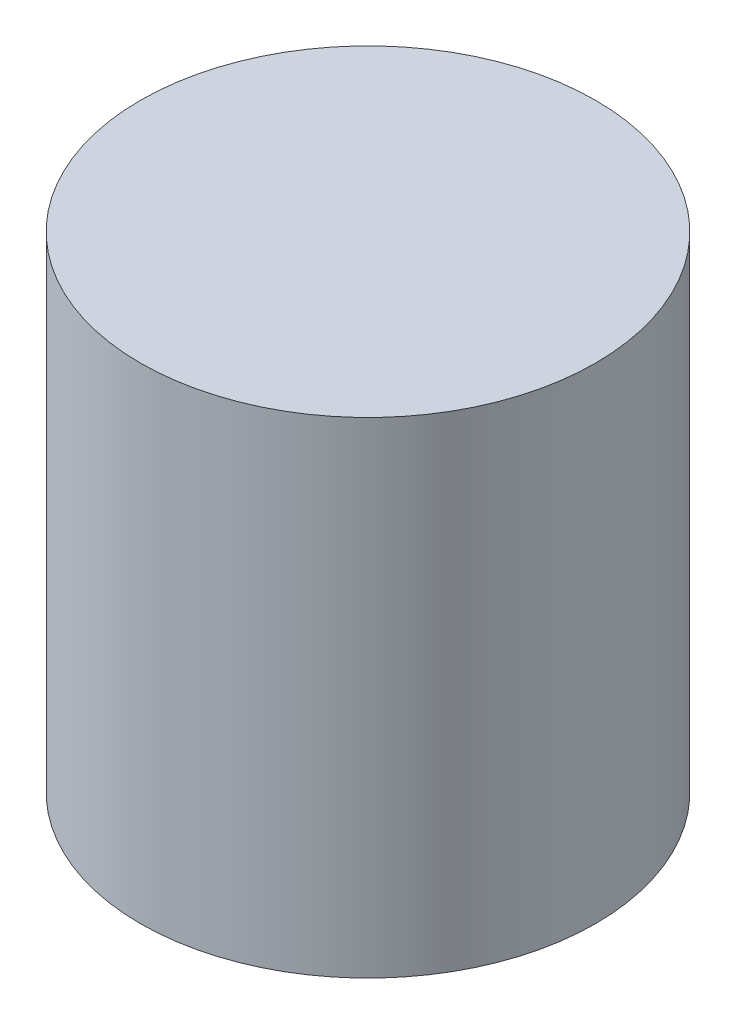
ISO-10303-21;
HEADER;
FILE_DESCRIPTION(('STEP AP214'),'2;1');
FILE_NAME('part.step','',(''),(''),'','','');
FILE_SCHEMA(('AUTOMOTIVE_DESIGN { 1 0 10303 214 1 1 1 1 }'));
ENDSEC;
DATA;
#1=APPLICATION_CONTEXT('core data for automotive mechanical design processes');
#2=APPLICATION_PROTOCOL_DEFINITION('international standard','automotive_design',2000,#1);
#3=PRODUCT_CONTEXT('',#1,'mechanical');
#4=PRODUCT('Part','Part','',(#3));
#5=PRODUCT_RELATED_PRODUCT_CATEGORY('part','',(#4));
#6=PRODUCT_DEFINITION_FORMATION('','',#4);
#7=PRODUCT_DEFINITION_CONTEXT('part definition',#1,'design');
#8=PRODUCT_DEFINITION('design','',#6,#7);
#9=PRODUCT_DEFINITION_SHAPE('','',#8);
#10=(LENGTH_UNIT() NAMED_UNIT(*) SI_UNIT(.MILLI.,.METRE.));
#11=(NAMED_UNIT(*) PLANE_ANGLE_UNIT() SI_UNIT($,.RADIAN.));
#12=(NAMED_UNIT(*) SI_UNIT($,.STERADIAN.) SOLID_ANGLE_UNIT());
#13=UNCERTAINTY_MEASURE_WITH_UNIT(LENGTH_MEASURE(1.E-05),#10,'distance_accuracy_value','');
#14=(GEOMETRIC_REPRESENTATION_CONTEXT(3) GLOBAL_UNCERTAINTY_ASSIGNED_CONTEXT((#13)) GLOBAL_UNIT_ASSIGNED_CONTEXT((#10,
#11,#12)) REPRESENTATION_CONTEXT('',''));
#15=CARTESIAN_POINT('',(0.,0.,0.));
#16=DIRECTION('',(0.,0.,1.));
#17=DIRECTION('',(1.,0.,0.));
#18=AXIS2_PLACEMENT_3D('',#15,#16,#17);
#19=CARTESIAN_POINT('',(0.,16.,0.));
#20=DIRECTION('',(0.,-1.,0.));
#21=DIRECTION('',(0.,0.,-1.));
#22=AXIS2_PLACEMENT_3D('',#19,#20,#21);
#23=CYLINDRICAL_SURFACE('',#22,7.50000000000001);
#24=CARTESIAN_POINT('',(0.,16.,0.));
#25=DIRECTION('',(0.,1.,0.));
#26=DIRECTION('',(0.,0.,1.));
#27=AXIS2_PLACEMENT_3D('',#24,#25,#26);
#28=CIRCLE('',#27,7.50000000000001);
#29=CARTESIAN_POINT('',(0.,16.,7.50000000000001));
#30=VERTEX_POINT('',#29);
#31=EDGE_CURVE('E10',#30,#30,#28,.T.);
#32=ORIENTED_EDGE('',*,*,#31,.F.);
#33=EDGE_LOOP('',(#32));
#34=FACE_BOUND('',#33,.T.);
#35=CARTESIAN_POINT('',(0.,0.,0.));
#36=DIRECTION('',(0.,1.,0.));
#37=DIRECTION('',(0.,0.,1.));
#38=AXIS2_PLACEMENT_3D('',#35,#36,#37);
#39=CIRCLE('',#38,7.50000000000001);
#40=CARTESIAN_POINT('',(0.,0.,7.50000000000001));
#41=VERTEX_POINT('',#40);
#42=EDGE_CURVE('E42',#41,#41,#39,.T.);
#43=ORIENTED_EDGE('',*,*,#42,.T.);
#44=EDGE_LOOP('',(#43));
#45=FACE_BOUND('',#44,.T.);
#46=ADVANCED_FACE('F39',(#34,#45),#23,.T.);
#47=CARTESIAN_POINT('',(0.,16.,0.));
#48=DIRECTION('',(0.,1.,0.));
#49=DIRECTION('',(0.,0.,1.));
#50=AXIS2_PLACEMENT_3D('',#47,#48,#49);
#51=PLANE('',#50);
#52=ORIENTED_EDGE('',*,*,#31,.T.);
#53=EDGE_LOOP('',(#52));
#54=FACE_BOUND('',#53,.T.);
#55=ADVANCED_FACE('F56',(#54),#51,.T.);
#56=CARTESIAN_POINT('',(0.,0.,0.));
#57=DIRECTION('',(0.,1.,0.));
#58=DIRECTION('',(0.,0.,1.));
#59=AXIS2_PLACEMENT_3D('',#56,#57,#58);
#60=PLANE('',#59);
#61=ORIENTED_EDGE('',*,*,#42,.F.);
#62=EDGE_LOOP('',(#61));
#63=FACE_BOUND('',#62,.T.);
#64=ADVANCED_FACE('F54',(#63),#60,.F.);
#65=CLOSED_SHELL('',(#46,#55,#64));
#66=MANIFOLD_SOLID_BREP('B2',#65);
#67=ADVANCED_BREP_SHAPE_REPRESENTATION('',(#18,#66),#14);
#68=SHAPE_DEFINITION_REPRESENTATION(#9,#67);
ENDSEC;
END-ISO-10303-21;
